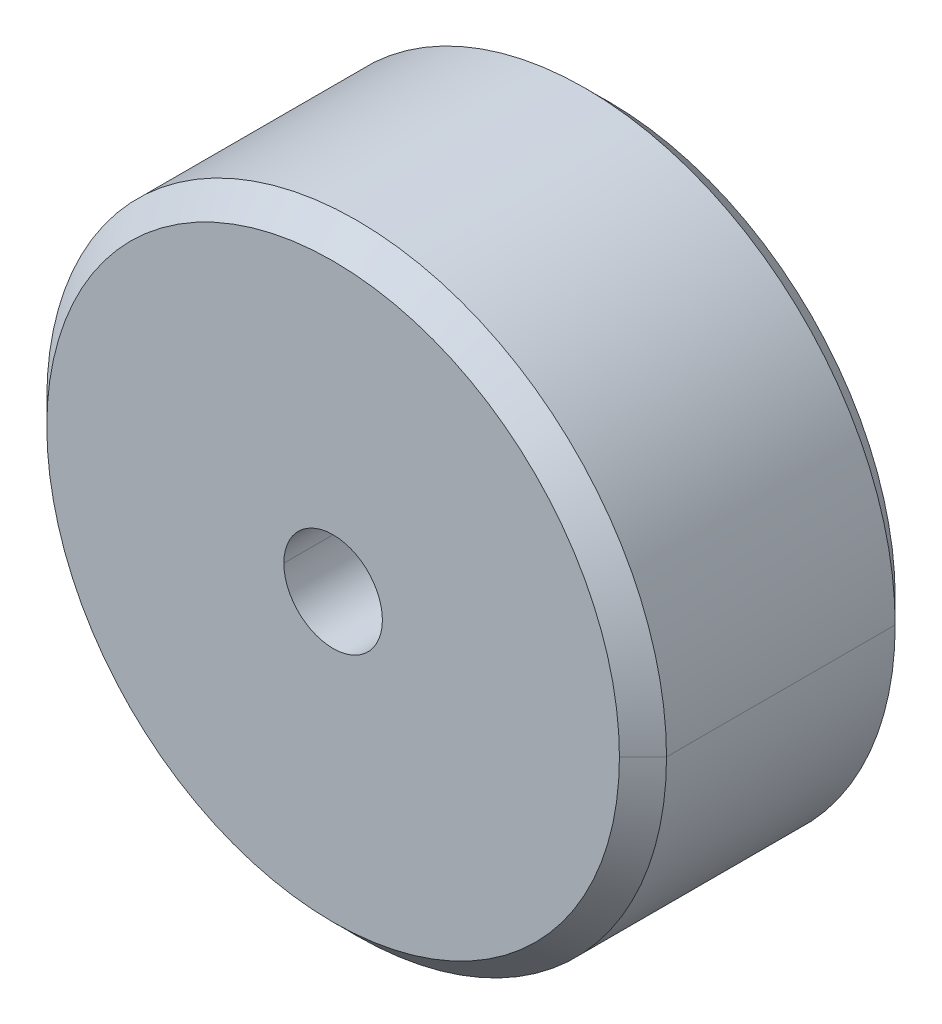
ISO-10303-21;
HEADER;
FILE_DESCRIPTION(('STEP AP214'),'2;1');
FILE_NAME('part.step','',(''),(''),'','','');
FILE_SCHEMA(('AUTOMOTIVE_DESIGN { 1 0 10303 214 1 1 1 1 }'));
ENDSEC;
DATA;
#1=APPLICATION_CONTEXT('core data for automotive mechanical design processes');
#2=APPLICATION_PROTOCOL_DEFINITION('international standard','automotive_design',2000,#1);
#3=PRODUCT_CONTEXT('',#1,'mechanical');
#4=PRODUCT('Part','Part','',(#3));
#5=PRODUCT_RELATED_PRODUCT_CATEGORY('part','',(#4));
#6=PRODUCT_DEFINITION_FORMATION('','',#4);
#7=PRODUCT_DEFINITION_CONTEXT('part definition',#1,'design');
#8=PRODUCT_DEFINITION('design','',#6,#7);
#9=PRODUCT_DEFINITION_SHAPE('','',#8);
#10=(LENGTH_UNIT() NAMED_UNIT(*) SI_UNIT(.MILLI.,.METRE.));
#11=(NAMED_UNIT(*) PLANE_ANGLE_UNIT() SI_UNIT($,.RADIAN.));
#12=(NAMED_UNIT(*) SI_UNIT($,.STERADIAN.) SOLID_ANGLE_UNIT());
#13=UNCERTAINTY_MEASURE_WITH_UNIT(LENGTH_MEASURE(1.E-05),#10,'distance_accuracy_value','');
#14=(GEOMETRIC_REPRESENTATION_CONTEXT(3) GLOBAL_UNCERTAINTY_ASSIGNED_CONTEXT((#13)) GLOBAL_UNIT_ASSIGNED_CONTEXT((#10,
#11,#12)) REPRESENTATION_CONTEXT('',''));
#15=CARTESIAN_POINT('',(0.,0.,0.));
#16=DIRECTION('',(0.,0.,1.));
#17=DIRECTION('',(1.,0.,0.));
#18=AXIS2_PLACEMENT_3D('',#15,#16,#17);
#19=CARTESIAN_POINT('',(0.,0.,4.45));
#20=DIRECTION('',(0.,0.,-1.));
#21=DIRECTION('',(-1.,0.,0.));
#22=AXIS2_PLACEMENT_3D('',#19,#20,#21);
#23=CONICAL_SURFACE('',#22,9.24,0.785398163397448);
#24=DIRECTION('',(0.707106781186547,0.,-0.707106781186548));
#25=VECTOR('',#24,1.);
#26=CARTESIAN_POINT('',(9.24,0.,4.45));
#27=LINE('',#26,#25);
#28=CARTESIAN_POINT('',(9.24,0.,4.45));
#29=VERTEX_POINT('',#28);
#30=CARTESIAN_POINT('',(10.,0.,3.69));
#31=VERTEX_POINT('',#30);
#32=EDGE_CURVE('E143',#29,#31,#27,.T.);
#33=ORIENTED_EDGE('',*,*,#32,.F.);
#34=CARTESIAN_POINT('',(0.,0.,4.45));
#35=DIRECTION('',(0.,0.,1.));
#36=DIRECTION('',(1.,0.,0.));
#37=AXIS2_PLACEMENT_3D('',#34,#35,#36);
#38=CIRCLE('',#37,9.24);
#39=CARTESIAN_POINT('',(-9.24,0.,4.45));
#40=VERTEX_POINT('',#39);
#41=EDGE_CURVE('E87',#40,#29,#38,.T.);
#42=ORIENTED_EDGE('',*,*,#41,.F.);
#43=DIRECTION('',(-0.707106781186547,0.,-0.707106781186548));
#44=VECTOR('',#43,1.);
#45=CARTESIAN_POINT('',(-9.24,0.,4.45));
#46=LINE('',#45,#44);
#47=CARTESIAN_POINT('',(-10.,0.,3.69));
#48=VERTEX_POINT('',#47);
#49=EDGE_CURVE('E142',#40,#48,#46,.T.);
#50=ORIENTED_EDGE('',*,*,#49,.T.);
#51=CARTESIAN_POINT('',(0.,0.,3.69));
#52=DIRECTION('',(0.,0.,-1.));
#53=DIRECTION('',(1.,0.,0.));
#54=AXIS2_PLACEMENT_3D('',#51,#52,#53);
#55=CIRCLE('',#54,10.);
#56=EDGE_CURVE('E26',#31,#48,#55,.T.);
#57=ORIENTED_EDGE('',*,*,#56,.F.);
#58=EDGE_LOOP('',(#33,#42,#50,#57));
#59=FACE_BOUND('',#58,.T.);
#60=ADVANCED_FACE('F15',(#59),#23,.T.);
#61=CARTESIAN_POINT('',(0.,0.,-3.69));
#62=DIRECTION('',(0.,0.,1.));
#63=DIRECTION('',(1.,0.,0.));
#64=AXIS2_PLACEMENT_3D('',#61,#62,#63);
#65=CONICAL_SURFACE('',#64,10.,0.785398163397449);
#66=DIRECTION('',(-0.707106781186549,0.,0.707106781186547));
#67=VECTOR('',#66,1.);
#68=CARTESIAN_POINT('',(-10.,0.,-3.69));
#69=LINE('',#68,#67);
#70=CARTESIAN_POINT('',(-9.24,0.,-4.45));
#71=VERTEX_POINT('',#70);
#72=CARTESIAN_POINT('',(-10.,0.,-3.69));
#73=VERTEX_POINT('',#72);
#74=EDGE_CURVE('E19',#71,#73,#69,.T.);
#75=ORIENTED_EDGE('',*,*,#74,.F.);
#76=CARTESIAN_POINT('',(0.,0.,-4.45));
#77=DIRECTION('',(0.,0.,-1.));
#78=DIRECTION('',(1.,0.,0.));
#79=AXIS2_PLACEMENT_3D('',#76,#77,#78);
#80=CIRCLE('',#79,9.24);
#81=CARTESIAN_POINT('',(9.24,0.,-4.45));
#82=VERTEX_POINT('',#81);
#83=EDGE_CURVE('E76',#82,#71,#80,.T.);
#84=ORIENTED_EDGE('',*,*,#83,.F.);
#85=DIRECTION('',(0.707106781186549,0.,0.707106781186547));
#86=VECTOR('',#85,1.);
#87=CARTESIAN_POINT('',(10.,0.,-3.69));
#88=LINE('',#87,#86);
#89=CARTESIAN_POINT('',(10.,0.,-3.69));
#90=VERTEX_POINT('',#89);
#91=EDGE_CURVE('E123',#82,#90,#88,.T.);
#92=ORIENTED_EDGE('',*,*,#91,.T.);
#93=CARTESIAN_POINT('',(0.,0.,-3.69));
#94=DIRECTION('',(0.,0.,1.));
#95=DIRECTION('',(1.,0.,0.));
#96=AXIS2_PLACEMENT_3D('',#93,#94,#95);
#97=CIRCLE('',#96,10.);
#98=EDGE_CURVE('E10',#73,#90,#97,.T.);
#99=ORIENTED_EDGE('',*,*,#98,.F.);
#100=EDGE_LOOP('',(#75,#84,#92,#99));
#101=FACE_BOUND('',#100,.T.);
#102=ADVANCED_FACE('F191',(#101),#65,.T.);
#103=CARTESIAN_POINT('',(0.,0.,4.45));
#104=DIRECTION('',(0.,0.,-1.));
#105=DIRECTION('',(-1.,0.,0.));
#106=AXIS2_PLACEMENT_3D('',#103,#104,#105);
#107=CYLINDRICAL_SURFACE('',#106,1.59);
#108=DIRECTION('',(0.,0.,-1.));
#109=VECTOR('',#108,1.);
#110=CARTESIAN_POINT('',(1.59,0.,4.45));
#111=LINE('',#110,#109);
#112=CARTESIAN_POINT('',(1.59,0.,4.45));
#113=VERTEX_POINT('',#112);
#114=CARTESIAN_POINT('',(1.59,0.,-4.45));
#115=VERTEX_POINT('',#114);
#116=EDGE_CURVE('E113',#113,#115,#111,.T.);
#117=ORIENTED_EDGE('',*,*,#116,.F.);
#118=CARTESIAN_POINT('',(0.,0.,4.45));
#119=DIRECTION('',(0.,0.,1.));
#120=DIRECTION('',(1.,0.,0.));
#121=AXIS2_PLACEMENT_3D('',#118,#119,#120);
#122=CIRCLE('',#121,1.59);
#123=CARTESIAN_POINT('',(-1.59,0.,4.45));
#124=VERTEX_POINT('',#123);
#125=EDGE_CURVE('E103',#113,#124,#122,.T.);
#126=ORIENTED_EDGE('',*,*,#125,.T.);
#127=DIRECTION('',(0.,0.,-1.));
#128=VECTOR('',#127,1.);
#129=CARTESIAN_POINT('',(-1.59,0.,4.45));
#130=LINE('',#129,#128);
#131=CARTESIAN_POINT('',(-1.59,0.,-4.45));
#132=VERTEX_POINT('',#131);
#133=EDGE_CURVE('E121',#124,#132,#130,.T.);
#134=ORIENTED_EDGE('',*,*,#133,.T.);
#135=CARTESIAN_POINT('',(0.,0.,-4.45));
#136=DIRECTION('',(0.,0.,1.));
#137=DIRECTION('',(1.,0.,0.));
#138=AXIS2_PLACEMENT_3D('',#135,#136,#137);
#139=CIRCLE('',#138,1.59);
#140=EDGE_CURVE('E39',#115,#132,#139,.T.);
#141=ORIENTED_EDGE('',*,*,#140,.F.);
#142=EDGE_LOOP('',(#117,#126,#134,#141));
#143=FACE_BOUND('',#142,.T.);
#144=ADVANCED_FACE('F114',(#143),#107,.F.);
#145=CARTESIAN_POINT('',(0.,0.,4.45));
#146=DIRECTION('',(0.,0.,-1.));
#147=DIRECTION('',(-1.,0.,0.));
#148=AXIS2_PLACEMENT_3D('',#145,#146,#147);
#149=CYLINDRICAL_SURFACE('',#148,10.);
#150=DIRECTION('',(0.,0.,-1.));
#151=VECTOR('',#150,1.);
#152=CARTESIAN_POINT('',(10.,0.,4.45));
#153=LINE('',#152,#151);
#154=EDGE_CURVE('E164',#31,#90,#153,.T.);
#155=ORIENTED_EDGE('',*,*,#154,.F.);
#156=ORIENTED_EDGE('',*,*,#56,.T.);
#157=DIRECTION('',(0.,0.,-1.));
#158=VECTOR('',#157,1.);
#159=CARTESIAN_POINT('',(-10.,0.,4.45));
#160=LINE('',#159,#158);
#161=EDGE_CURVE('E169',#48,#73,#160,.T.);
#162=ORIENTED_EDGE('',*,*,#161,.T.);
#163=ORIENTED_EDGE('',*,*,#98,.T.);
#164=EDGE_LOOP('',(#155,#156,#162,#163));
#165=FACE_BOUND('',#164,.T.);
#166=ADVANCED_FACE('F204',(#165),#149,.T.);
#167=CARTESIAN_POINT('',(0.,0.,-4.45));
#168=DIRECTION('',(0.,0.,1.));
#169=DIRECTION('',(1.,0.,0.));
#170=AXIS2_PLACEMENT_3D('',#167,#168,#169);
#171=PLANE('',#170);
#172=CARTESIAN_POINT('',(0.,0.,-4.45));
#173=DIRECTION('',(0.,0.,1.));
#174=DIRECTION('',(1.,0.,0.));
#175=AXIS2_PLACEMENT_3D('',#172,#173,#174);
#176=CIRCLE('',#175,1.59);
#177=EDGE_CURVE('E118',#132,#115,#176,.T.);
#178=ORIENTED_EDGE('',*,*,#177,.T.);
#179=ORIENTED_EDGE('',*,*,#140,.T.);
#180=EDGE_LOOP('',(#178,#179));
#181=FACE_BOUND('',#180,.T.);
#182=ORIENTED_EDGE('',*,*,#83,.T.);
#183=CARTESIAN_POINT('',(0.,0.,-4.45));
#184=DIRECTION('',(0.,0.,-1.));
#185=DIRECTION('',(1.,0.,0.));
#186=AXIS2_PLACEMENT_3D('',#183,#184,#185);
#187=CIRCLE('',#186,9.24);
#188=EDGE_CURVE('E145',#71,#82,#187,.T.);
#189=ORIENTED_EDGE('',*,*,#188,.T.);
#190=EDGE_LOOP('',(#182,#189));
#191=FACE_BOUND('',#190,.T.);
#192=ADVANCED_FACE('F201',(#181,#191),#171,.F.);
#193=CARTESIAN_POINT('',(0.,0.,4.45));
#194=DIRECTION('',(0.,0.,1.));
#195=DIRECTION('',(1.,0.,0.));
#196=AXIS2_PLACEMENT_3D('',#193,#194,#195);
#197=PLANE('',#196);
#198=CARTESIAN_POINT('',(0.,0.,4.45));
#199=DIRECTION('',(0.,0.,1.));
#200=DIRECTION('',(1.,0.,0.));
#201=AXIS2_PLACEMENT_3D('',#198,#199,#200);
#202=CIRCLE('',#201,1.59);
#203=EDGE_CURVE('E107',#124,#113,#202,.T.);
#204=ORIENTED_EDGE('',*,*,#203,.F.);
#205=ORIENTED_EDGE('',*,*,#125,.F.);
#206=EDGE_LOOP('',(#204,#205));
#207=FACE_BOUND('',#206,.T.);
#208=ORIENTED_EDGE('',*,*,#41,.T.);
#209=CARTESIAN_POINT('',(0.,0.,4.45));
#210=DIRECTION('',(0.,0.,1.));
#211=DIRECTION('',(1.,0.,0.));
#212=AXIS2_PLACEMENT_3D('',#209,#210,#211);
#213=CIRCLE('',#212,9.24);
#214=EDGE_CURVE('E180',#29,#40,#213,.T.);
#215=ORIENTED_EDGE('',*,*,#214,.T.);
#216=EDGE_LOOP('',(#208,#215));
#217=FACE_BOUND('',#216,.T.);
#218=ADVANCED_FACE('F17',(#207,#217),#197,.T.);
#219=CARTESIAN_POINT('',(0.,0.,4.45));
#220=DIRECTION('',(0.,0.,-1.));
#221=DIRECTION('',(-1.,0.,0.));
#222=AXIS2_PLACEMENT_3D('',#219,#220,#221);
#223=CYLINDRICAL_SURFACE('',#222,10.);
#224=CARTESIAN_POINT('',(0.,0.,3.69));
#225=DIRECTION('',(0.,0.,-1.));
#226=DIRECTION('',(1.,0.,0.));
#227=AXIS2_PLACEMENT_3D('',#224,#225,#226);
#228=CIRCLE('',#227,10.);
#229=EDGE_CURVE('E138',#48,#31,#228,.T.);
#230=ORIENTED_EDGE('',*,*,#229,.T.);
#231=ORIENTED_EDGE('',*,*,#154,.T.);
#232=CARTESIAN_POINT('',(0.,0.,-3.69));
#233=DIRECTION('',(0.,0.,1.));
#234=DIRECTION('',(1.,0.,0.));
#235=AXIS2_PLACEMENT_3D('',#232,#233,#234);
#236=CIRCLE('',#235,10.);
#237=EDGE_CURVE('E129',#90,#73,#236,.T.);
#238=ORIENTED_EDGE('',*,*,#237,.T.);
#239=ORIENTED_EDGE('',*,*,#161,.F.);
#240=EDGE_LOOP('',(#230,#231,#238,#239));
#241=FACE_BOUND('',#240,.T.);
#242=ADVANCED_FACE('F207',(#241),#223,.T.);
#243=CARTESIAN_POINT('',(0.,0.,4.45));
#244=DIRECTION('',(0.,0.,-1.));
#245=DIRECTION('',(-1.,0.,0.));
#246=AXIS2_PLACEMENT_3D('',#243,#244,#245);
#247=CYLINDRICAL_SURFACE('',#246,1.59);
#248=ORIENTED_EDGE('',*,*,#203,.T.);
#249=ORIENTED_EDGE('',*,*,#116,.T.);
#250=ORIENTED_EDGE('',*,*,#177,.F.);
#251=ORIENTED_EDGE('',*,*,#133,.F.);
#252=EDGE_LOOP('',(#248,#249,#250,#251));
#253=FACE_BOUND('',#252,.T.);
#254=ADVANCED_FACE('F120',(#253),#247,.F.);
#255=CARTESIAN_POINT('',(0.,0.,-3.69));
#256=DIRECTION('',(0.,0.,1.));
#257=DIRECTION('',(1.,0.,0.));
#258=AXIS2_PLACEMENT_3D('',#255,#256,#257);
#259=CONICAL_SURFACE('',#258,10.,0.785398163397449);
#260=ORIENTED_EDGE('',*,*,#188,.F.);
#261=ORIENTED_EDGE('',*,*,#74,.T.);
#262=ORIENTED_EDGE('',*,*,#237,.F.);
#263=ORIENTED_EDGE('',*,*,#91,.F.);
#264=EDGE_LOOP('',(#260,#261,#262,#263));
#265=FACE_BOUND('',#264,.T.);
#266=ADVANCED_FACE('F206',(#265),#259,.T.);
#267=CARTESIAN_POINT('',(0.,0.,4.45));
#268=DIRECTION('',(0.,0.,-1.));
#269=DIRECTION('',(-1.,0.,0.));
#270=AXIS2_PLACEMENT_3D('',#267,#268,#269);
#271=CONICAL_SURFACE('',#270,9.24,0.785398163397448);
#272=ORIENTED_EDGE('',*,*,#214,.F.);
#273=ORIENTED_EDGE('',*,*,#32,.T.);
#274=ORIENTED_EDGE('',*,*,#229,.F.);
#275=ORIENTED_EDGE('',*,*,#49,.F.);
#276=EDGE_LOOP('',(#272,#273,#274,#275));
#277=FACE_BOUND('',#276,.T.);
#278=ADVANCED_FACE('F188',(#277),#271,.T.);
#279=CLOSED_SHELL('',(#60,#102,#144,#166,#192,#218,#242,#254,#266,#278));
#280=MANIFOLD_SOLID_BREP('B1',#279);
#281=ADVANCED_BREP_SHAPE_REPRESENTATION('',(#18,#280),#14);
#282=SHAPE_DEFINITION_REPRESENTATION(#9,#281);
ENDSEC;
END-ISO-10303-21;
